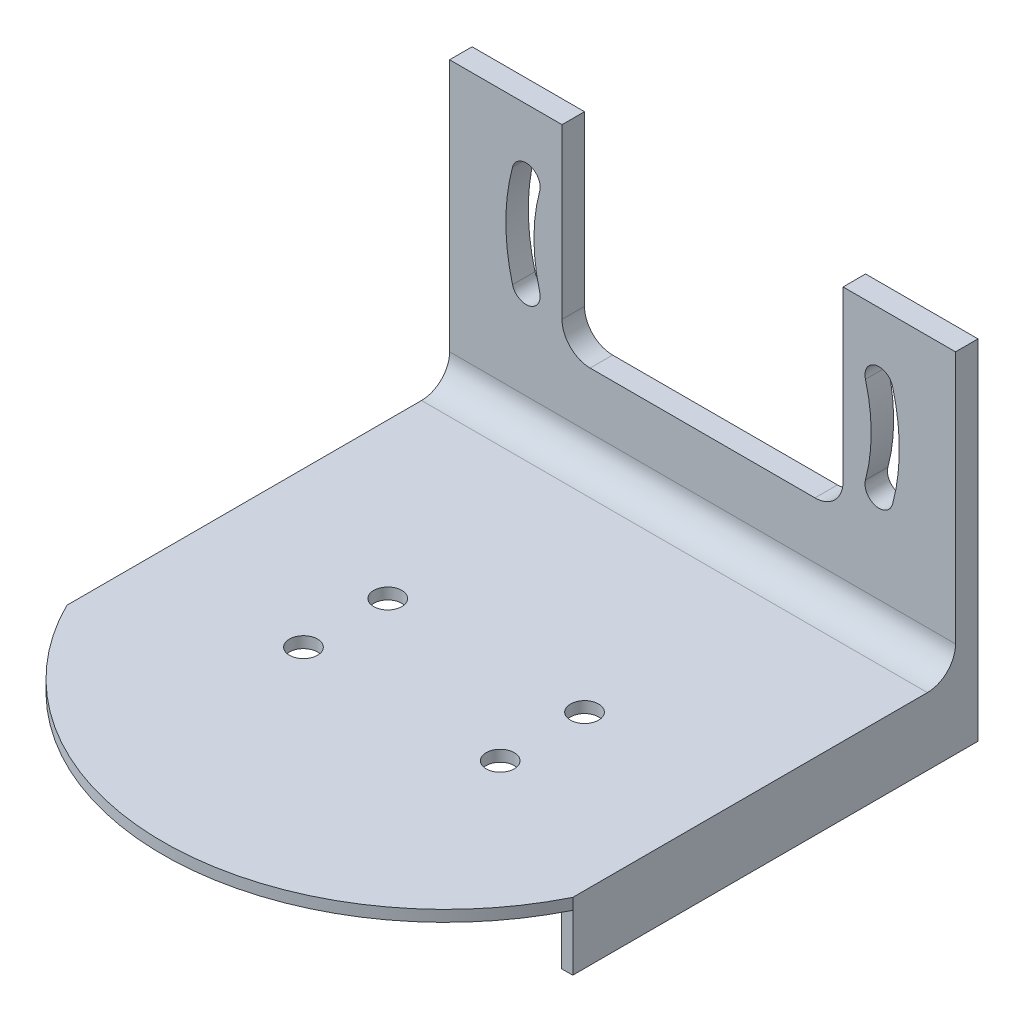
ISO-10303-21;
HEADER;
FILE_DESCRIPTION(('STEP AP214'),'2;1');
FILE_NAME('part.step','',(''),(''),'','','');
FILE_SCHEMA(('AUTOMOTIVE_DESIGN { 1 0 10303 214 1 1 1 1 }'));
ENDSEC;
DATA;
#1=APPLICATION_CONTEXT('core data for automotive mechanical design processes');
#2=APPLICATION_PROTOCOL_DEFINITION('international standard','automotive_design',2000,#1);
#3=PRODUCT_CONTEXT('',#1,'mechanical');
#4=PRODUCT('Part','Part','',(#3));
#5=PRODUCT_RELATED_PRODUCT_CATEGORY('part','',(#4));
#6=PRODUCT_DEFINITION_FORMATION('','',#4);
#7=PRODUCT_DEFINITION_CONTEXT('part definition',#1,'design');
#8=PRODUCT_DEFINITION('design','',#6,#7);
#9=PRODUCT_DEFINITION_SHAPE('','',#8);
#10=(LENGTH_UNIT() NAMED_UNIT(*) SI_UNIT(.MILLI.,.METRE.));
#11=(NAMED_UNIT(*) PLANE_ANGLE_UNIT() SI_UNIT($,.RADIAN.));
#12=(NAMED_UNIT(*) SI_UNIT($,.STERADIAN.) SOLID_ANGLE_UNIT());
#13=UNCERTAINTY_MEASURE_WITH_UNIT(LENGTH_MEASURE(1.E-05),#10,'distance_accuracy_value','');
#14=(GEOMETRIC_REPRESENTATION_CONTEXT(3) GLOBAL_UNCERTAINTY_ASSIGNED_CONTEXT((#13)) GLOBAL_UNIT_ASSIGNED_CONTEXT((#10,
#11,#12)) REPRESENTATION_CONTEXT('',''));
#15=CARTESIAN_POINT('',(0.,0.,0.));
#16=DIRECTION('',(0.,0.,1.));
#17=DIRECTION('',(1.,0.,0.));
#18=AXIS2_PLACEMENT_3D('',#15,#16,#17);
#19=CARTESIAN_POINT('',(0.,0.,0.));
#20=DIRECTION('',(0.,-1.,0.));
#21=DIRECTION('',(0.,0.,-1.));
#22=AXIS2_PLACEMENT_3D('',#19,#20,#21);
#23=PLANE('',#22);
#24=CARTESIAN_POINT('',(-17.5,0.,7.5));
#25=DIRECTION('',(0.,-1.,0.));
#26=DIRECTION('',(0.,0.,-1.));
#27=AXIS2_PLACEMENT_3D('',#24,#25,#26);
#28=CIRCLE('',#27,2.5);
#29=CARTESIAN_POINT('',(-17.5,0.,5.));
#30=VERTEX_POINT('',#29);
#31=EDGE_CURVE('E280',#30,#30,#28,.T.);
#32=ORIENTED_EDGE('',*,*,#31,.F.);
#33=EDGE_LOOP('',(#32));
#34=FACE_BOUND('',#33,.T.);
#35=CARTESIAN_POINT('',(17.5,0.,7.5));
#36=DIRECTION('',(0.,-1.,0.));
#37=DIRECTION('',(0.,0.,-1.));
#38=AXIS2_PLACEMENT_3D('',#35,#36,#37);
#39=CIRCLE('',#38,2.5);
#40=CARTESIAN_POINT('',(17.5,0.,5.));
#41=VERTEX_POINT('',#40);
#42=EDGE_CURVE('E284',#41,#41,#39,.T.);
#43=ORIENTED_EDGE('',*,*,#42,.F.);
#44=EDGE_LOOP('',(#43));
#45=FACE_BOUND('',#44,.T.);
#46=CARTESIAN_POINT('',(17.5,0.,-7.5));
#47=DIRECTION('',(0.,-1.,0.));
#48=DIRECTION('',(0.,0.,-1.));
#49=AXIS2_PLACEMENT_3D('',#46,#47,#48);
#50=CIRCLE('',#49,2.5);
#51=CARTESIAN_POINT('',(17.5,0.,-10.));
#52=VERTEX_POINT('',#51);
#53=EDGE_CURVE('E288',#52,#52,#50,.T.);
#54=ORIENTED_EDGE('',*,*,#53,.F.);
#55=EDGE_LOOP('',(#54));
#56=FACE_BOUND('',#55,.T.);
#57=CARTESIAN_POINT('',(-17.5,0.,-7.5));
#58=DIRECTION('',(0.,-1.,0.));
#59=DIRECTION('',(0.,0.,-1.));
#60=AXIS2_PLACEMENT_3D('',#57,#58,#59);
#61=CIRCLE('',#60,2.5);
#62=CARTESIAN_POINT('',(-17.5,0.,-10.));
#63=VERTEX_POINT('',#62);
#64=EDGE_CURVE('E292',#63,#63,#61,.T.);
#65=ORIENTED_EDGE('',*,*,#64,.F.);
#66=EDGE_LOOP('',(#65));
#67=FACE_BOUND('',#66,.T.);
#68=DIRECTION('',(0.,0.,-1.));
#69=VECTOR('',#68,1.);
#70=CARTESIAN_POINT('',(43.,0.,-50.));
#71=LINE('',#70,#69);
#72=CARTESIAN_POINT('',(43.,0.,22.0935167306728));
#73=VERTEX_POINT('',#72);
#74=CARTESIAN_POINT('',(43.,0.,-50.));
#75=VERTEX_POINT('',#74);
#76=EDGE_CURVE('E51',#73,#75,#71,.T.);
#77=ORIENTED_EDGE('',*,*,#76,.F.);
#78=DIRECTION('',(-1.,0.,0.));
#79=VECTOR('',#78,1.);
#80=CARTESIAN_POINT('',(45.,0.,22.0935167306728));
#81=LINE('',#80,#79);
#82=CARTESIAN_POINT('',(45.,0.,22.0935167306728));
#83=VERTEX_POINT('',#82);
#84=EDGE_CURVE('E555',#83,#73,#81,.T.);
#85=ORIENTED_EDGE('',*,*,#84,.F.);
#86=CARTESIAN_POINT('',(0.,0.,-0.235133201877558));
#87=DIRECTION('',(0.,-1.,0.));
#88=DIRECTION('',(0.,0.,-1.));
#89=AXIS2_PLACEMENT_3D('',#86,#87,#88);
#90=CIRCLE('',#89,50.2351332018776);
#91=CARTESIAN_POINT('',(-45.,0.,22.0935167306728));
#92=VERTEX_POINT('',#91);
#93=EDGE_CURVE('E259',#92,#83,#90,.F.);
#94=ORIENTED_EDGE('',*,*,#93,.F.);
#95=DIRECTION('',(-1.,0.,0.));
#96=VECTOR('',#95,1.);
#97=CARTESIAN_POINT('',(-45.,0.,22.0935167306728));
#98=LINE('',#97,#96);
#99=CARTESIAN_POINT('',(-43.,0.,22.0935167306728));
#100=VERTEX_POINT('',#99);
#101=EDGE_CURVE('E233',#100,#92,#98,.T.);
#102=ORIENTED_EDGE('',*,*,#101,.F.);
#103=DIRECTION('',(0.,0.,1.));
#104=VECTOR('',#103,1.);
#105=CARTESIAN_POINT('',(-43.,0.,-50.));
#106=LINE('',#105,#104);
#107=CARTESIAN_POINT('',(-43.,0.,-50.));
#108=VERTEX_POINT('',#107);
#109=EDGE_CURVE('E230',#108,#100,#106,.T.);
#110=ORIENTED_EDGE('',*,*,#109,.F.);
#111=DIRECTION('',(-1.,0.,0.));
#112=VECTOR('',#111,1.);
#113=CARTESIAN_POINT('',(100.,0.,-50.));
#114=LINE('',#113,#112);
#115=EDGE_CURVE('E37',#75,#108,#114,.T.);
#116=ORIENTED_EDGE('',*,*,#115,.F.);
#117=EDGE_LOOP('',(#77,#85,#94,#102,#110,#116));
#118=FACE_BOUND('',#117,.T.);
#119=ADVANCED_FACE('F33',(#34,#45,#56,#67,#118),#23,.T.);
#120=CARTESIAN_POINT('',(0.,2.,0.));
#121=DIRECTION('',(0.,-1.,0.));
#122=DIRECTION('',(0.,0.,-1.));
#123=AXIS2_PLACEMENT_3D('',#120,#121,#122);
#124=PLANE('',#123);
#125=CARTESIAN_POINT('',(-17.5,2.,7.5));
#126=DIRECTION('',(0.,1.,0.));
#127=DIRECTION('',(0.,0.,-1.));
#128=AXIS2_PLACEMENT_3D('',#125,#126,#127);
#129=CIRCLE('',#128,2.5);
#130=CARTESIAN_POINT('',(-17.5,2.,5.));
#131=VERTEX_POINT('',#130);
#132=EDGE_CURVE('E277',#131,#131,#129,.T.);
#133=ORIENTED_EDGE('',*,*,#132,.F.);
#134=EDGE_LOOP('',(#133));
#135=FACE_BOUND('',#134,.T.);
#136=CARTESIAN_POINT('',(17.5,2.,7.5));
#137=DIRECTION('',(0.,1.,0.));
#138=DIRECTION('',(0.,0.,1.));
#139=AXIS2_PLACEMENT_3D('',#136,#137,#138);
#140=CIRCLE('',#139,2.5);
#141=CARTESIAN_POINT('',(17.5,2.,10.));
#142=VERTEX_POINT('',#141);
#143=EDGE_CURVE('E281',#142,#142,#140,.T.);
#144=ORIENTED_EDGE('',*,*,#143,.F.);
#145=EDGE_LOOP('',(#144));
#146=FACE_BOUND('',#145,.T.);
#147=CARTESIAN_POINT('',(17.5,2.,-7.5));
#148=DIRECTION('',(0.,1.,0.));
#149=DIRECTION('',(0.,0.,-1.));
#150=AXIS2_PLACEMENT_3D('',#147,#148,#149);
#151=CIRCLE('',#150,2.5);
#152=CARTESIAN_POINT('',(17.5,2.,-10.));
#153=VERTEX_POINT('',#152);
#154=EDGE_CURVE('E285',#153,#153,#151,.T.);
#155=ORIENTED_EDGE('',*,*,#154,.F.);
#156=EDGE_LOOP('',(#155));
#157=FACE_BOUND('',#156,.T.);
#158=CARTESIAN_POINT('',(-17.5,2.,-7.5));
#159=DIRECTION('',(0.,1.,0.));
#160=DIRECTION('',(0.,0.,1.));
#161=AXIS2_PLACEMENT_3D('',#158,#159,#160);
#162=CIRCLE('',#161,2.5);
#163=CARTESIAN_POINT('',(-17.5,2.,-5.));
#164=VERTEX_POINT('',#163);
#165=EDGE_CURVE('E289',#164,#164,#162,.T.);
#166=ORIENTED_EDGE('',*,*,#165,.F.);
#167=EDGE_LOOP('',(#166));
#168=FACE_BOUND('',#167,.T.);
#169=DIRECTION('',(0.,0.,-1.));
#170=VECTOR('',#169,1.);
#171=CARTESIAN_POINT('',(-45.,2.,0.));
#172=LINE('',#171,#170);
#173=CARTESIAN_POINT('',(-45.,2.,22.0935167306728));
#174=VERTEX_POINT('',#173);
#175=CARTESIAN_POINT('',(-45.,2.,-41.));
#176=VERTEX_POINT('',#175);
#177=EDGE_CURVE('E275',#174,#176,#172,.T.);
#178=ORIENTED_EDGE('',*,*,#177,.F.);
#179=CARTESIAN_POINT('',(0.,2.,-0.235133201877558));
#180=DIRECTION('',(0.,-1.,0.));
#181=DIRECTION('',(0.,0.,-1.));
#182=AXIS2_PLACEMENT_3D('',#179,#180,#181);
#183=CIRCLE('',#182,50.2351332018776);
#184=CARTESIAN_POINT('',(45.,2.,22.0935167306728));
#185=VERTEX_POINT('',#184);
#186=EDGE_CURVE('E261',#174,#185,#183,.F.);
#187=ORIENTED_EDGE('',*,*,#186,.T.);
#188=DIRECTION('',(0.,0.,-1.));
#189=VECTOR('',#188,1.);
#190=CARTESIAN_POINT('',(45.,2.,0.));
#191=LINE('',#190,#189);
#192=CARTESIAN_POINT('',(45.,2.,-41.));
#193=VERTEX_POINT('',#192);
#194=EDGE_CURVE('E272',#185,#193,#191,.T.);
#195=ORIENTED_EDGE('',*,*,#194,.T.);
#196=DIRECTION('',(-1.,0.,0.));
#197=VECTOR('',#196,1.);
#198=CARTESIAN_POINT('',(45.,2.,-41.));
#199=LINE('',#198,#197);
#200=EDGE_CURVE('E269',#193,#176,#199,.T.);
#201=ORIENTED_EDGE('',*,*,#200,.T.);
#202=EDGE_LOOP('',(#178,#187,#195,#201));
#203=FACE_BOUND('',#202,.T.);
#204=ADVANCED_FACE('F416',(#135,#146,#157,#168,#203),#124,.F.);
#205=CARTESIAN_POINT('',(100.,2.,-50.));
#206=DIRECTION('',(0.,0.,1.));
#207=DIRECTION('',(1.,0.,0.));
#208=AXIS2_PLACEMENT_3D('',#205,#206,#207);
#209=PLANE('',#208);
#210=CARTESIAN_POINT('',(0.,32.,-50.));
#211=DIRECTION('',(0.,0.,-1.));
#212=DIRECTION('',(-1.,0.,0.));
#213=AXIS2_PLACEMENT_3D('',#210,#211,#212);
#214=CIRCLE('',#213,35.);
#215=CARTESIAN_POINT('',(33.8074039201174,41.0586665785883,-50.));
#216=VERTEX_POINT('',#215);
#217=CARTESIAN_POINT('',(33.8074039201174,22.9413334214118,-50.));
#218=VERTEX_POINT('',#217);
#219=EDGE_CURVE('E315',#216,#218,#214,.T.);
#220=ORIENTED_EDGE('',*,*,#219,.F.);
#221=CARTESIAN_POINT('',(31.3925893543947,40.4116189658319,-50.));
#222=DIRECTION('',(0.,0.,-1.));
#223=DIRECTION('',(-1.,0.,0.));
#224=AXIS2_PLACEMENT_3D('',#221,#222,#223);
#225=CIRCLE('',#224,2.5);
#226=CARTESIAN_POINT('',(28.977774788672,39.7645713530756,-50.));
#227=VERTEX_POINT('',#226);
#228=EDGE_CURVE('E307',#227,#216,#225,.T.);
#229=ORIENTED_EDGE('',*,*,#228,.F.);
#230=CARTESIAN_POINT('',(0.,32.,-50.));
#231=DIRECTION('',(0.,0.,1.));
#232=DIRECTION('',(-1.,0.,0.));
#233=AXIS2_PLACEMENT_3D('',#230,#231,#232);
#234=CIRCLE('',#233,30.);
#235=CARTESIAN_POINT('',(28.977774788672,24.2354286469244,-50.));
#236=VERTEX_POINT('',#235);
#237=EDGE_CURVE('E321',#236,#227,#234,.T.);
#238=ORIENTED_EDGE('',*,*,#237,.F.);
#239=CARTESIAN_POINT('',(31.3925893543947,23.5883810341681,-50.));
#240=DIRECTION('',(0.,0.,-1.));
#241=DIRECTION('',(1.,0.,0.));
#242=AXIS2_PLACEMENT_3D('',#239,#240,#241);
#243=CIRCLE('',#242,2.5);
#244=EDGE_CURVE('E318',#218,#236,#243,.T.);
#245=ORIENTED_EDGE('',*,*,#244,.F.);
#246=EDGE_LOOP('',(#220,#229,#238,#245));
#247=FACE_BOUND('',#246,.T.);
#248=CARTESIAN_POINT('',(-31.3925893543947,23.5883810341681,-50.));
#249=DIRECTION('',(0.,0.,-1.));
#250=DIRECTION('',(-1.,0.,0.));
#251=AXIS2_PLACEMENT_3D('',#248,#249,#250);
#252=CIRCLE('',#251,2.50000000000001);
#253=CARTESIAN_POINT('',(-28.9777747886721,24.2354286469244,-50.));
#254=VERTEX_POINT('',#253);
#255=CARTESIAN_POINT('',(-33.8074039201174,22.9413334214118,-50.));
#256=VERTEX_POINT('',#255);
#257=EDGE_CURVE('E295',#254,#256,#252,.T.);
#258=ORIENTED_EDGE('',*,*,#257,.F.);
#259=CARTESIAN_POINT('',(0.,32.,-50.));
#260=DIRECTION('',(0.,0.,1.));
#261=DIRECTION('',(-1.,0.,0.));
#262=AXIS2_PLACEMENT_3D('',#259,#260,#261);
#263=CIRCLE('',#262,30.);
#264=CARTESIAN_POINT('',(-28.977774788672,39.7645713530756,-50.));
#265=VERTEX_POINT('',#264);
#266=EDGE_CURVE('E293',#265,#254,#263,.T.);
#267=ORIENTED_EDGE('',*,*,#266,.F.);
#268=CARTESIAN_POINT('',(-31.3925893543947,40.411618965832,-50.));
#269=DIRECTION('',(0.,0.,-1.));
#270=DIRECTION('',(1.,0.,0.));
#271=AXIS2_PLACEMENT_3D('',#268,#269,#270);
#272=CIRCLE('',#271,2.5);
#273=CARTESIAN_POINT('',(-33.8074039201174,41.0586665785883,-50.));
#274=VERTEX_POINT('',#273);
#275=EDGE_CURVE('E301',#274,#265,#272,.T.);
#276=ORIENTED_EDGE('',*,*,#275,.F.);
#277=CARTESIAN_POINT('',(0.,32.,-50.));
#278=DIRECTION('',(0.,0.,-1.));
#279=DIRECTION('',(-1.,0.,0.));
#280=AXIS2_PLACEMENT_3D('',#277,#278,#279);
#281=CIRCLE('',#280,35.);
#282=EDGE_CURVE('E298',#256,#274,#281,.T.);
#283=ORIENTED_EDGE('',*,*,#282,.F.);
#284=EDGE_LOOP('',(#258,#267,#276,#283));
#285=FACE_BOUND('',#284,.T.);
#286=DIRECTION('',(0.,-1.,0.));
#287=VECTOR('',#286,1.);
#288=CARTESIAN_POINT('',(45.,52.,-50.));
#289=LINE('',#288,#287);
#290=CARTESIAN_POINT('',(45.,52.,-50.));
#291=VERTEX_POINT('',#290);
#292=CARTESIAN_POINT('',(45.,-10.,-50.));
#293=VERTEX_POINT('',#292);
#294=EDGE_CURVE('E561',#291,#293,#289,.T.);
#295=ORIENTED_EDGE('',*,*,#294,.T.);
#296=DIRECTION('',(1.,0.,0.));
#297=VECTOR('',#296,1.);
#298=CARTESIAN_POINT('',(45.,-10.,-50.));
#299=LINE('',#298,#297);
#300=CARTESIAN_POINT('',(43.,-10.,-50.));
#301=VERTEX_POINT('',#300);
#302=EDGE_CURVE('E222',#301,#293,#299,.T.);
#303=ORIENTED_EDGE('',*,*,#302,.F.);
#304=DIRECTION('',(0.,1.,0.));
#305=VECTOR('',#304,1.);
#306=CARTESIAN_POINT('',(43.,-10.,-50.));
#307=LINE('',#306,#305);
#308=EDGE_CURVE('E235',#301,#75,#307,.T.);
#309=ORIENTED_EDGE('',*,*,#308,.T.);
#310=ORIENTED_EDGE('',*,*,#115,.T.);
#311=DIRECTION('',(0.,1.,0.));
#312=VECTOR('',#311,1.);
#313=CARTESIAN_POINT('',(-43.,-10.,-50.));
#314=LINE('',#313,#312);
#315=CARTESIAN_POINT('',(-43.,-10.,-50.));
#316=VERTEX_POINT('',#315);
#317=EDGE_CURVE('E256',#316,#108,#314,.T.);
#318=ORIENTED_EDGE('',*,*,#317,.F.);
#319=DIRECTION('',(1.,0.,0.));
#320=VECTOR('',#319,1.);
#321=CARTESIAN_POINT('',(-45.,-10.,-50.));
#322=LINE('',#321,#320);
#323=CARTESIAN_POINT('',(-45.,-10.,-50.));
#324=VERTEX_POINT('',#323);
#325=EDGE_CURVE('E242',#324,#316,#322,.T.);
#326=ORIENTED_EDGE('',*,*,#325,.F.);
#327=DIRECTION('',(0.,-1.,0.));
#328=VECTOR('',#327,1.);
#329=CARTESIAN_POINT('',(-45.,52.,-50.));
#330=LINE('',#329,#328);
#331=CARTESIAN_POINT('',(-45.,52.,-50.));
#332=VERTEX_POINT('',#331);
#333=EDGE_CURVE('E392',#332,#324,#330,.T.);
#334=ORIENTED_EDGE('',*,*,#333,.F.);
#335=DIRECTION('',(-1.,0.,0.));
#336=VECTOR('',#335,1.);
#337=CARTESIAN_POINT('',(0.,52.,-50.));
#338=LINE('',#337,#336);
#339=CARTESIAN_POINT('',(-25.,52.,-50.));
#340=VERTEX_POINT('',#339);
#341=EDGE_CURVE('E360',#340,#332,#338,.T.);
#342=ORIENTED_EDGE('',*,*,#341,.F.);
#343=DIRECTION('',(0.,-1.,0.));
#344=VECTOR('',#343,1.);
#345=CARTESIAN_POINT('',(-25.,0.,-50.));
#346=LINE('',#345,#344);
#347=CARTESIAN_POINT('',(-25.,22.,-50.));
#348=VERTEX_POINT('',#347);
#349=EDGE_CURVE('E339',#340,#348,#346,.T.);
#350=ORIENTED_EDGE('',*,*,#349,.T.);
#351=CARTESIAN_POINT('',(-20.,22.,-50.));
#352=DIRECTION('',(0.,0.,-1.));
#353=DIRECTION('',(-1.,0.,0.));
#354=AXIS2_PLACEMENT_3D('',#351,#352,#353);
#355=CIRCLE('',#354,5.);
#356=CARTESIAN_POINT('',(-20.,17.,-50.));
#357=VERTEX_POINT('',#356);
#358=EDGE_CURVE('E336',#357,#348,#355,.T.);
#359=ORIENTED_EDGE('',*,*,#358,.F.);
#360=DIRECTION('',(1.,0.,0.));
#361=VECTOR('',#360,1.);
#362=CARTESIAN_POINT('',(0.,17.,-50.));
#363=LINE('',#362,#361);
#364=CARTESIAN_POINT('',(20.,17.,-50.));
#365=VERTEX_POINT('',#364);
#366=EDGE_CURVE('E327',#357,#365,#363,.T.);
#367=ORIENTED_EDGE('',*,*,#366,.T.);
#368=CARTESIAN_POINT('',(20.,22.,-50.));
#369=DIRECTION('',(0.,0.,-1.));
#370=DIRECTION('',(-1.,0.,0.));
#371=AXIS2_PLACEMENT_3D('',#368,#369,#370);
#372=CIRCLE('',#371,5.);
#373=CARTESIAN_POINT('',(25.,22.,-50.));
#374=VERTEX_POINT('',#373);
#375=EDGE_CURVE('E345',#365,#374,#372,.F.);
#376=ORIENTED_EDGE('',*,*,#375,.T.);
#377=DIRECTION('',(0.,1.,0.));
#378=VECTOR('',#377,1.);
#379=CARTESIAN_POINT('',(25.,0.,-50.));
#380=LINE('',#379,#378);
#381=CARTESIAN_POINT('',(25.,52.,-50.));
#382=VERTEX_POINT('',#381);
#383=EDGE_CURVE('E342',#374,#382,#380,.T.);
#384=ORIENTED_EDGE('',*,*,#383,.T.);
#385=EDGE_CURVE('E370',#291,#382,#338,.T.);
#386=ORIENTED_EDGE('',*,*,#385,.F.);
#387=EDGE_LOOP('',(#295,#303,#309,#310,#318,#326,#334,#342,#350,#359,#367,#376,#384,#386));
#388=FACE_BOUND('',#387,.T.);
#389=ADVANCED_FACE('F35',(#247,#285,#388),#209,.F.);
#390=CARTESIAN_POINT('',(-45.,52.,-46.));
#391=DIRECTION('',(0.,0.,-1.));
#392=DIRECTION('',(-1.,0.,0.));
#393=AXIS2_PLACEMENT_3D('',#390,#391,#392);
#394=PLANE('',#393);
#395=CARTESIAN_POINT('',(-31.3925893543947,40.411618965832,-46.));
#396=DIRECTION('',(0.,0.,-1.));
#397=DIRECTION('',(-1.,0.,0.));
#398=AXIS2_PLACEMENT_3D('',#395,#396,#397);
#399=CIRCLE('',#398,2.5);
#400=CARTESIAN_POINT('',(-33.8074039201174,41.0586665785883,-46.));
#401=VERTEX_POINT('',#400);
#402=CARTESIAN_POINT('',(-28.977774788672,39.7645713530756,-46.));
#403=VERTEX_POINT('',#402);
#404=EDGE_CURVE('E602',#401,#403,#399,.T.);
#405=ORIENTED_EDGE('',*,*,#404,.T.);
#406=CARTESIAN_POINT('',(0.,32.,-46.));
#407=DIRECTION('',(0.,0.,-1.));
#408=DIRECTION('',(-1.,0.,0.));
#409=AXIS2_PLACEMENT_3D('',#406,#407,#408);
#410=CIRCLE('',#409,30.);
#411=CARTESIAN_POINT('',(-28.9777747886721,24.2354286469244,-46.));
#412=VERTEX_POINT('',#411);
#413=EDGE_CURVE('E43',#403,#412,#410,.F.);
#414=ORIENTED_EDGE('',*,*,#413,.T.);
#415=CARTESIAN_POINT('',(-31.3925893543947,23.5883810341681,-46.));
#416=DIRECTION('',(0.,0.,-1.));
#417=DIRECTION('',(-1.,0.,0.));
#418=AXIS2_PLACEMENT_3D('',#415,#416,#417);
#419=CIRCLE('',#418,2.50000000000001);
#420=CARTESIAN_POINT('',(-33.8074039201174,22.9413334214118,-46.));
#421=VERTEX_POINT('',#420);
#422=EDGE_CURVE('E596',#412,#421,#419,.T.);
#423=ORIENTED_EDGE('',*,*,#422,.T.);
#424=CARTESIAN_POINT('',(0.,32.,-46.));
#425=DIRECTION('',(0.,0.,-1.));
#426=DIRECTION('',(-1.,0.,0.));
#427=AXIS2_PLACEMENT_3D('',#424,#425,#426);
#428=CIRCLE('',#427,35.);
#429=EDGE_CURVE('E599',#421,#401,#428,.T.);
#430=ORIENTED_EDGE('',*,*,#429,.T.);
#431=EDGE_LOOP('',(#405,#414,#423,#430));
#432=FACE_BOUND('',#431,.T.);
#433=CARTESIAN_POINT('',(0.,32.,-46.));
#434=DIRECTION('',(0.,0.,-1.));
#435=DIRECTION('',(-1.,0.,0.));
#436=AXIS2_PLACEMENT_3D('',#433,#434,#435);
#437=CIRCLE('',#436,30.);
#438=CARTESIAN_POINT('',(28.977774788672,24.2354286469244,-46.));
#439=VERTEX_POINT('',#438);
#440=CARTESIAN_POINT('',(28.977774788672,39.7645713530756,-46.));
#441=VERTEX_POINT('',#440);
#442=EDGE_CURVE('E590',#439,#441,#437,.F.);
#443=ORIENTED_EDGE('',*,*,#442,.T.);
#444=CARTESIAN_POINT('',(31.3925893543947,40.4116189658319,-46.));
#445=DIRECTION('',(0.,0.,-1.));
#446=DIRECTION('',(-1.,0.,0.));
#447=AXIS2_PLACEMENT_3D('',#444,#445,#446);
#448=CIRCLE('',#447,2.5);
#449=CARTESIAN_POINT('',(33.8074039201174,41.0586665785883,-46.));
#450=VERTEX_POINT('',#449);
#451=EDGE_CURVE('E593',#441,#450,#448,.T.);
#452=ORIENTED_EDGE('',*,*,#451,.T.);
#453=CARTESIAN_POINT('',(0.,32.,-46.));
#454=DIRECTION('',(0.,0.,-1.));
#455=DIRECTION('',(-1.,0.,0.));
#456=AXIS2_PLACEMENT_3D('',#453,#454,#455);
#457=CIRCLE('',#456,35.);
#458=CARTESIAN_POINT('',(33.8074039201174,22.9413334214118,-46.));
#459=VERTEX_POINT('',#458);
#460=EDGE_CURVE('E584',#450,#459,#457,.T.);
#461=ORIENTED_EDGE('',*,*,#460,.T.);
#462=CARTESIAN_POINT('',(31.3925893543947,23.5883810341681,-46.));
#463=DIRECTION('',(0.,0.,-1.));
#464=DIRECTION('',(-1.,0.,0.));
#465=AXIS2_PLACEMENT_3D('',#462,#463,#464);
#466=CIRCLE('',#465,2.5);
#467=EDGE_CURVE('E587',#459,#439,#466,.T.);
#468=ORIENTED_EDGE('',*,*,#467,.T.);
#469=EDGE_LOOP('',(#443,#452,#461,#468));
#470=FACE_BOUND('',#469,.T.);
#471=DIRECTION('',(0.,-1.,0.));
#472=VECTOR('',#471,1.);
#473=CARTESIAN_POINT('',(-45.,52.,-46.));
#474=LINE('',#473,#472);
#475=CARTESIAN_POINT('',(-45.,52.,-46.));
#476=VERTEX_POINT('',#475);
#477=CARTESIAN_POINT('',(-45.,7.00000000000004,-46.));
#478=VERTEX_POINT('',#477);
#479=EDGE_CURVE('E567',#476,#478,#474,.T.);
#480=ORIENTED_EDGE('',*,*,#479,.T.);
#481=DIRECTION('',(-1.,0.,0.));
#482=VECTOR('',#481,1.);
#483=CARTESIAN_POINT('',(45.,7.00000000000004,-46.));
#484=LINE('',#483,#482);
#485=CARTESIAN_POINT('',(45.,7.00000000000004,-46.));
#486=VERTEX_POINT('',#485);
#487=EDGE_CURVE('E266',#486,#478,#484,.T.);
#488=ORIENTED_EDGE('',*,*,#487,.F.);
#489=DIRECTION('',(0.,-1.,0.));
#490=VECTOR('',#489,1.);
#491=CARTESIAN_POINT('',(45.,52.,-46.));
#492=LINE('',#491,#490);
#493=CARTESIAN_POINT('',(45.,52.,-46.));
#494=VERTEX_POINT('',#493);
#495=EDGE_CURVE('E563',#494,#486,#492,.T.);
#496=ORIENTED_EDGE('',*,*,#495,.F.);
#497=DIRECTION('',(1.,0.,0.));
#498=VECTOR('',#497,1.);
#499=CARTESIAN_POINT('',(-45.,52.,-46.));
#500=LINE('',#499,#498);
#501=CARTESIAN_POINT('',(25.,52.,-46.));
#502=VERTEX_POINT('',#501);
#503=EDGE_CURVE('E633',#502,#494,#500,.T.);
#504=ORIENTED_EDGE('',*,*,#503,.F.);
#505=DIRECTION('',(0.,1.,0.));
#506=VECTOR('',#505,1.);
#507=CARTESIAN_POINT('',(25.,52.,-46.));
#508=LINE('',#507,#506);
#509=CARTESIAN_POINT('',(25.,22.,-46.));
#510=VERTEX_POINT('',#509);
#511=EDGE_CURVE('E358',#510,#502,#508,.T.);
#512=ORIENTED_EDGE('',*,*,#511,.F.);
#513=CARTESIAN_POINT('',(20.,22.,-46.));
#514=DIRECTION('',(0.,0.,-1.));
#515=DIRECTION('',(-1.,0.,0.));
#516=AXIS2_PLACEMENT_3D('',#513,#514,#515);
#517=CIRCLE('',#516,5.);
#518=CARTESIAN_POINT('',(20.,17.,-46.));
#519=VERTEX_POINT('',#518);
#520=EDGE_CURVE('E582',#519,#510,#517,.F.);
#521=ORIENTED_EDGE('',*,*,#520,.F.);
#522=DIRECTION('',(1.,0.,0.));
#523=VECTOR('',#522,1.);
#524=CARTESIAN_POINT('',(-45.,17.,-46.));
#525=LINE('',#524,#523);
#526=CARTESIAN_POINT('',(-20.,17.,-46.));
#527=VERTEX_POINT('',#526);
#528=EDGE_CURVE('E580',#527,#519,#525,.T.);
#529=ORIENTED_EDGE('',*,*,#528,.F.);
#530=CARTESIAN_POINT('',(-20.,22.,-46.));
#531=DIRECTION('',(0.,0.,-1.));
#532=DIRECTION('',(-1.,0.,0.));
#533=AXIS2_PLACEMENT_3D('',#530,#531,#532);
#534=CIRCLE('',#533,5.);
#535=CARTESIAN_POINT('',(-25.,22.,-46.));
#536=VERTEX_POINT('',#535);
#537=EDGE_CURVE('E577',#527,#536,#534,.T.);
#538=ORIENTED_EDGE('',*,*,#537,.T.);
#539=DIRECTION('',(0.,-1.,0.));
#540=VECTOR('',#539,1.);
#541=CARTESIAN_POINT('',(-25.,52.,-46.));
#542=LINE('',#541,#540);
#543=CARTESIAN_POINT('',(-25.,52.,-46.));
#544=VERTEX_POINT('',#543);
#545=EDGE_CURVE('E351',#544,#536,#542,.T.);
#546=ORIENTED_EDGE('',*,*,#545,.F.);
#547=EDGE_CURVE('E363',#476,#544,#500,.T.);
#548=ORIENTED_EDGE('',*,*,#547,.F.);
#549=EDGE_LOOP('',(#480,#488,#496,#504,#512,#521,#529,#538,#546,#548));
#550=FACE_BOUND('',#549,.T.);
#551=ADVANCED_FACE('F429',(#432,#470,#550),#394,.F.);
#552=CARTESIAN_POINT('',(0.,52.,0.));
#553=DIRECTION('',(0.,-1.,0.));
#554=DIRECTION('',(0.,0.,-1.));
#555=AXIS2_PLACEMENT_3D('',#552,#553,#554);
#556=PLANE('',#555);
#557=DIRECTION('',(0.,0.,-1.));
#558=VECTOR('',#557,1.);
#559=CARTESIAN_POINT('',(25.,52.,0.));
#560=LINE('',#559,#558);
#561=EDGE_CURVE('E575',#502,#382,#560,.T.);
#562=ORIENTED_EDGE('',*,*,#561,.F.);
#563=ORIENTED_EDGE('',*,*,#503,.T.);
#564=DIRECTION('',(0.,0.,-1.));
#565=VECTOR('',#564,1.);
#566=CARTESIAN_POINT('',(45.,52.,-50.));
#567=LINE('',#566,#565);
#568=EDGE_CURVE('E564',#494,#291,#567,.T.);
#569=ORIENTED_EDGE('',*,*,#568,.T.);
#570=ORIENTED_EDGE('',*,*,#385,.T.);
#571=EDGE_LOOP('',(#562,#563,#569,#570));
#572=FACE_BOUND('',#571,.T.);
#573=ADVANCED_FACE('F432',(#572),#556,.F.);
#574=DIRECTION('',(0.,0.,1.));
#575=VECTOR('',#574,1.);
#576=CARTESIAN_POINT('',(-25.,52.,0.));
#577=LINE('',#576,#575);
#578=EDGE_CURVE('E391',#340,#544,#577,.T.);
#579=ORIENTED_EDGE('',*,*,#578,.F.);
#580=ORIENTED_EDGE('',*,*,#341,.T.);
#581=DIRECTION('',(0.,0.,1.));
#582=VECTOR('',#581,1.);
#583=CARTESIAN_POINT('',(-45.,52.,-50.));
#584=LINE('',#583,#582);
#585=EDGE_CURVE('E373',#332,#476,#584,.T.);
#586=ORIENTED_EDGE('',*,*,#585,.T.);
#587=ORIENTED_EDGE('',*,*,#547,.T.);
#588=EDGE_LOOP('',(#579,#580,#586,#587));
#589=FACE_BOUND('',#588,.T.);
#590=ADVANCED_FACE('F428',(#589),#556,.F.);
#591=CARTESIAN_POINT('',(-45.,52.,-50.));
#592=DIRECTION('',(1.,0.,0.));
#593=DIRECTION('',(0.,0.,-1.));
#594=AXIS2_PLACEMENT_3D('',#591,#592,#593);
#595=PLANE('',#594);
#596=ORIENTED_EDGE('',*,*,#333,.T.);
#597=DIRECTION('',(0.,0.,-1.));
#598=VECTOR('',#597,1.);
#599=CARTESIAN_POINT('',(-45.,-10.,-50.));
#600=LINE('',#599,#598);
#601=CARTESIAN_POINT('',(-45.,-10.,22.0935167306728));
#602=VERTEX_POINT('',#601);
#603=EDGE_CURVE('E239',#602,#324,#600,.T.);
#604=ORIENTED_EDGE('',*,*,#603,.F.);
#605=DIRECTION('',(0.,1.,0.));
#606=VECTOR('',#605,1.);
#607=CARTESIAN_POINT('',(-45.,-10.,22.0935167306728));
#608=LINE('',#607,#606);
#609=EDGE_CURVE('E248',#602,#92,#608,.T.);
#610=ORIENTED_EDGE('',*,*,#609,.T.);
#611=DIRECTION('',(0.,-1.,0.));
#612=VECTOR('',#611,1.);
#613=CARTESIAN_POINT('',(-45.,182.295268241175,22.0935167306728));
#614=LINE('',#613,#612);
#615=EDGE_CURVE('E257',#174,#92,#614,.T.);
#616=ORIENTED_EDGE('',*,*,#615,.F.);
#617=ORIENTED_EDGE('',*,*,#177,.T.);
#618=CARTESIAN_POINT('',(-45.,7.,-41.));
#619=DIRECTION('',(1.,0.,0.));
#620=DIRECTION('',(0.,0.,1.));
#621=AXIS2_PLACEMENT_3D('',#618,#619,#620);
#622=CIRCLE('',#621,5.);
#623=EDGE_CURVE('E263',#176,#478,#622,.T.);
#624=ORIENTED_EDGE('',*,*,#623,.T.);
#625=ORIENTED_EDGE('',*,*,#479,.F.);
#626=ORIENTED_EDGE('',*,*,#585,.F.);
#627=EDGE_LOOP('',(#596,#604,#610,#616,#617,#624,#625,#626));
#628=FACE_BOUND('',#627,.T.);
#629=ADVANCED_FACE('F401',(#628),#595,.F.);
#630=CARTESIAN_POINT('',(45.,52.,-50.));
#631=DIRECTION('',(-1.,0.,0.));
#632=DIRECTION('',(0.,0.,1.));
#633=AXIS2_PLACEMENT_3D('',#630,#631,#632);
#634=PLANE('',#633);
#635=ORIENTED_EDGE('',*,*,#194,.F.);
#636=DIRECTION('',(0.,-1.,0.));
#637=VECTOR('',#636,1.);
#638=CARTESIAN_POINT('',(45.,182.295268241175,22.0935167306729));
#639=LINE('',#638,#637);
#640=EDGE_CURVE('E11',#185,#83,#639,.T.);
#641=ORIENTED_EDGE('',*,*,#640,.T.);
#642=DIRECTION('',(0.,1.,0.));
#643=VECTOR('',#642,1.);
#644=CARTESIAN_POINT('',(45.,-10.,22.0935167306728));
#645=LINE('',#644,#643);
#646=CARTESIAN_POINT('',(45.,-10.,22.0935167306728));
#647=VERTEX_POINT('',#646);
#648=EDGE_CURVE('E210',#647,#83,#645,.T.);
#649=ORIENTED_EDGE('',*,*,#648,.F.);
#650=DIRECTION('',(0.,0.,1.));
#651=VECTOR('',#650,1.);
#652=CARTESIAN_POINT('',(45.,-10.,-50.));
#653=LINE('',#652,#651);
#654=EDGE_CURVE('E216',#293,#647,#653,.T.);
#655=ORIENTED_EDGE('',*,*,#654,.F.);
#656=ORIENTED_EDGE('',*,*,#294,.F.);
#657=ORIENTED_EDGE('',*,*,#568,.F.);
#658=ORIENTED_EDGE('',*,*,#495,.T.);
#659=CARTESIAN_POINT('',(45.,7.,-41.));
#660=DIRECTION('',(1.,0.,0.));
#661=DIRECTION('',(0.,0.,1.));
#662=AXIS2_PLACEMENT_3D('',#659,#660,#661);
#663=CIRCLE('',#662,5.);
#664=EDGE_CURVE('E264',#193,#486,#663,.T.);
#665=ORIENTED_EDGE('',*,*,#664,.F.);
#666=EDGE_LOOP('',(#635,#641,#649,#655,#656,#657,#658,#665));
#667=FACE_BOUND('',#666,.T.);
#668=ADVANCED_FACE('F227',(#667),#634,.F.);
#669=CARTESIAN_POINT('',(0.,17.,0.));
#670=DIRECTION('',(0.,1.,0.));
#671=DIRECTION('',(0.,0.,1.));
#672=AXIS2_PLACEMENT_3D('',#669,#670,#671);
#673=PLANE('',#672);
#674=ORIENTED_EDGE('',*,*,#528,.T.);
#675=DIRECTION('',(0.,0.,-1.));
#676=VECTOR('',#675,1.);
#677=CARTESIAN_POINT('',(20.,17.,0.));
#678=LINE('',#677,#676);
#679=EDGE_CURVE('E349',#519,#365,#678,.T.);
#680=ORIENTED_EDGE('',*,*,#679,.T.);
#681=ORIENTED_EDGE('',*,*,#366,.F.);
#682=DIRECTION('',(0.,0.,-1.));
#683=VECTOR('',#682,1.);
#684=CARTESIAN_POINT('',(-20.,17.,0.));
#685=LINE('',#684,#683);
#686=EDGE_CURVE('E348',#527,#357,#685,.T.);
#687=ORIENTED_EDGE('',*,*,#686,.F.);
#688=EDGE_LOOP('',(#674,#680,#681,#687));
#689=FACE_BOUND('',#688,.T.);
#690=ADVANCED_FACE('F436',(#689),#673,.T.);
#691=CARTESIAN_POINT('',(20.,22.,0.));
#692=DIRECTION('',(0.,0.,-1.));
#693=DIRECTION('',(-1.,0.,0.));
#694=AXIS2_PLACEMENT_3D('',#691,#692,#693);
#695=CYLINDRICAL_SURFACE('',#694,5.);
#696=ORIENTED_EDGE('',*,*,#520,.T.);
#697=DIRECTION('',(0.,0.,-1.));
#698=VECTOR('',#697,1.);
#699=CARTESIAN_POINT('',(25.,22.,0.));
#700=LINE('',#699,#698);
#701=EDGE_CURVE('E352',#510,#374,#700,.T.);
#702=ORIENTED_EDGE('',*,*,#701,.T.);
#703=ORIENTED_EDGE('',*,*,#375,.F.);
#704=ORIENTED_EDGE('',*,*,#679,.F.);
#705=EDGE_LOOP('',(#696,#702,#703,#704));
#706=FACE_BOUND('',#705,.T.);
#707=ADVANCED_FACE('F442',(#706),#695,.F.);
#708=CARTESIAN_POINT('',(-20.,22.,0.));
#709=DIRECTION('',(0.,0.,-1.));
#710=DIRECTION('',(-1.,0.,0.));
#711=AXIS2_PLACEMENT_3D('',#708,#709,#710);
#712=CYLINDRICAL_SURFACE('',#711,5.);
#713=ORIENTED_EDGE('',*,*,#686,.T.);
#714=ORIENTED_EDGE('',*,*,#358,.T.);
#715=DIRECTION('',(0.,0.,-1.));
#716=VECTOR('',#715,1.);
#717=CARTESIAN_POINT('',(-25.,22.,0.));
#718=LINE('',#717,#716);
#719=EDGE_CURVE('E354',#536,#348,#718,.T.);
#720=ORIENTED_EDGE('',*,*,#719,.F.);
#721=ORIENTED_EDGE('',*,*,#537,.F.);
#722=EDGE_LOOP('',(#713,#714,#720,#721));
#723=FACE_BOUND('',#722,.T.);
#724=ADVANCED_FACE('F444',(#723),#712,.F.);
#725=CARTESIAN_POINT('',(25.,0.,0.));
#726=DIRECTION('',(-1.,0.,0.));
#727=DIRECTION('',(0.,0.,1.));
#728=AXIS2_PLACEMENT_3D('',#725,#726,#727);
#729=PLANE('',#728);
#730=ORIENTED_EDGE('',*,*,#511,.T.);
#731=ORIENTED_EDGE('',*,*,#561,.T.);
#732=ORIENTED_EDGE('',*,*,#383,.F.);
#733=ORIENTED_EDGE('',*,*,#701,.F.);
#734=EDGE_LOOP('',(#730,#731,#732,#733));
#735=FACE_BOUND('',#734,.T.);
#736=ADVANCED_FACE('F447',(#735),#729,.T.);
#737=CARTESIAN_POINT('',(-25.,0.,0.));
#738=DIRECTION('',(1.,0.,0.));
#739=DIRECTION('',(0.,0.,-1.));
#740=AXIS2_PLACEMENT_3D('',#737,#738,#739);
#741=PLANE('',#740);
#742=ORIENTED_EDGE('',*,*,#545,.T.);
#743=ORIENTED_EDGE('',*,*,#719,.T.);
#744=ORIENTED_EDGE('',*,*,#349,.F.);
#745=ORIENTED_EDGE('',*,*,#578,.T.);
#746=EDGE_LOOP('',(#742,#743,#744,#745));
#747=FACE_BOUND('',#746,.T.);
#748=ADVANCED_FACE('F449',(#747),#741,.T.);
#749=CARTESIAN_POINT('',(31.3925893543947,40.4116189658319,0.));
#750=DIRECTION('',(0.,0.,-1.));
#751=DIRECTION('',(-1.,0.,0.));
#752=AXIS2_PLACEMENT_3D('',#749,#750,#751);
#753=CYLINDRICAL_SURFACE('',#752,2.5);
#754=DIRECTION('',(0.,0.,-1.));
#755=VECTOR('',#754,1.);
#756=CARTESIAN_POINT('',(28.977774788672,39.7645713530756,0.));
#757=LINE('',#756,#755);
#758=EDGE_CURVE('E325',#441,#227,#757,.T.);
#759=ORIENTED_EDGE('',*,*,#758,.T.);
#760=ORIENTED_EDGE('',*,*,#228,.T.);
#761=DIRECTION('',(0.,0.,-1.));
#762=VECTOR('',#761,1.);
#763=CARTESIAN_POINT('',(33.8074039201174,41.0586665785883,0.));
#764=LINE('',#763,#762);
#765=EDGE_CURVE('E324',#450,#216,#764,.T.);
#766=ORIENTED_EDGE('',*,*,#765,.F.);
#767=ORIENTED_EDGE('',*,*,#451,.F.);
#768=EDGE_LOOP('',(#759,#760,#766,#767));
#769=FACE_BOUND('',#768,.T.);
#770=ADVANCED_FACE('F452',(#769),#753,.F.);
#771=CARTESIAN_POINT('',(0.,32.,0.));
#772=DIRECTION('',(0.,0.,-1.));
#773=DIRECTION('',(-1.,0.,0.));
#774=AXIS2_PLACEMENT_3D('',#771,#772,#773);
#775=CYLINDRICAL_SURFACE('',#774,30.);
#776=DIRECTION('',(0.,0.,-1.));
#777=VECTOR('',#776,1.);
#778=CARTESIAN_POINT('',(28.977774788672,24.2354286469244,0.));
#779=LINE('',#778,#777);
#780=EDGE_CURVE('E328',#439,#236,#779,.T.);
#781=ORIENTED_EDGE('',*,*,#780,.T.);
#782=ORIENTED_EDGE('',*,*,#237,.T.);
#783=ORIENTED_EDGE('',*,*,#758,.F.);
#784=ORIENTED_EDGE('',*,*,#442,.F.);
#785=EDGE_LOOP('',(#781,#782,#783,#784));
#786=FACE_BOUND('',#785,.T.);
#787=ADVANCED_FACE('F462',(#786),#775,.T.);
#788=CARTESIAN_POINT('',(31.3925893543947,23.5883810341681,0.));
#789=DIRECTION('',(0.,0.,-1.));
#790=DIRECTION('',(-1.,0.,0.));
#791=AXIS2_PLACEMENT_3D('',#788,#789,#790);
#792=CYLINDRICAL_SURFACE('',#791,2.5);
#793=DIRECTION('',(0.,0.,-1.));
#794=VECTOR('',#793,1.);
#795=CARTESIAN_POINT('',(33.8074039201174,22.9413334214118,0.));
#796=LINE('',#795,#794);
#797=EDGE_CURVE('E330',#459,#218,#796,.T.);
#798=ORIENTED_EDGE('',*,*,#797,.T.);
#799=ORIENTED_EDGE('',*,*,#244,.T.);
#800=ORIENTED_EDGE('',*,*,#780,.F.);
#801=ORIENTED_EDGE('',*,*,#467,.F.);
#802=EDGE_LOOP('',(#798,#799,#800,#801));
#803=FACE_BOUND('',#802,.T.);
#804=ADVANCED_FACE('F468',(#803),#792,.F.);
#805=CARTESIAN_POINT('',(0.,32.,0.));
#806=DIRECTION('',(0.,0.,-1.));
#807=DIRECTION('',(-1.,0.,0.));
#808=AXIS2_PLACEMENT_3D('',#805,#806,#807);
#809=CYLINDRICAL_SURFACE('',#808,35.);
#810=ORIENTED_EDGE('',*,*,#765,.T.);
#811=ORIENTED_EDGE('',*,*,#219,.T.);
#812=ORIENTED_EDGE('',*,*,#797,.F.);
#813=ORIENTED_EDGE('',*,*,#460,.F.);
#814=EDGE_LOOP('',(#810,#811,#812,#813));
#815=FACE_BOUND('',#814,.T.);
#816=ADVANCED_FACE('F464',(#815),#809,.F.);
#817=CARTESIAN_POINT('',(0.,32.,0.));
#818=DIRECTION('',(0.,0.,-1.));
#819=DIRECTION('',(-1.,0.,0.));
#820=AXIS2_PLACEMENT_3D('',#817,#818,#819);
#821=CYLINDRICAL_SURFACE('',#820,30.);
#822=DIRECTION('',(0.,0.,-1.));
#823=VECTOR('',#822,1.);
#824=CARTESIAN_POINT('',(-28.977774788672,39.7645713530756,0.));
#825=LINE('',#824,#823);
#826=EDGE_CURVE('E305',#403,#265,#825,.T.);
#827=ORIENTED_EDGE('',*,*,#826,.T.);
#828=ORIENTED_EDGE('',*,*,#266,.T.);
#829=DIRECTION('',(0.,0.,-1.));
#830=VECTOR('',#829,1.);
#831=CARTESIAN_POINT('',(-28.9777747886721,24.2354286469244,0.));
#832=LINE('',#831,#830);
#833=EDGE_CURVE('E304',#412,#254,#832,.T.);
#834=ORIENTED_EDGE('',*,*,#833,.F.);
#835=ORIENTED_EDGE('',*,*,#413,.F.);
#836=EDGE_LOOP('',(#827,#828,#834,#835));
#837=FACE_BOUND('',#836,.T.);
#838=ADVANCED_FACE('F467',(#837),#821,.T.);
#839=CARTESIAN_POINT('',(-31.3925893543947,40.411618965832,0.));
#840=DIRECTION('',(0.,0.,-1.));
#841=DIRECTION('',(-1.,0.,0.));
#842=AXIS2_PLACEMENT_3D('',#839,#840,#841);
#843=CYLINDRICAL_SURFACE('',#842,2.5);
#844=DIRECTION('',(0.,0.,-1.));
#845=VECTOR('',#844,1.);
#846=CARTESIAN_POINT('',(-33.8074039201174,41.0586665785883,0.));
#847=LINE('',#846,#845);
#848=EDGE_CURVE('E308',#401,#274,#847,.T.);
#849=ORIENTED_EDGE('',*,*,#848,.T.);
#850=ORIENTED_EDGE('',*,*,#275,.T.);
#851=ORIENTED_EDGE('',*,*,#826,.F.);
#852=ORIENTED_EDGE('',*,*,#404,.F.);
#853=EDGE_LOOP('',(#849,#850,#851,#852));
#854=FACE_BOUND('',#853,.T.);
#855=ADVANCED_FACE('F478',(#854),#843,.F.);
#856=CARTESIAN_POINT('',(0.,32.,0.));
#857=DIRECTION('',(0.,0.,-1.));
#858=DIRECTION('',(-1.,0.,0.));
#859=AXIS2_PLACEMENT_3D('',#856,#857,#858);
#860=CYLINDRICAL_SURFACE('',#859,35.);
#861=DIRECTION('',(0.,0.,-1.));
#862=VECTOR('',#861,1.);
#863=CARTESIAN_POINT('',(-33.8074039201174,22.9413334214118,0.));
#864=LINE('',#863,#862);
#865=EDGE_CURVE('E310',#421,#256,#864,.T.);
#866=ORIENTED_EDGE('',*,*,#865,.T.);
#867=ORIENTED_EDGE('',*,*,#282,.T.);
#868=ORIENTED_EDGE('',*,*,#848,.F.);
#869=ORIENTED_EDGE('',*,*,#429,.F.);
#870=EDGE_LOOP('',(#866,#867,#868,#869));
#871=FACE_BOUND('',#870,.T.);
#872=ADVANCED_FACE('F484',(#871),#860,.F.);
#873=CARTESIAN_POINT('',(-31.3925893543947,23.5883810341681,0.));
#874=DIRECTION('',(0.,0.,-1.));
#875=DIRECTION('',(-1.,0.,0.));
#876=AXIS2_PLACEMENT_3D('',#873,#874,#875);
#877=CYLINDRICAL_SURFACE('',#876,2.50000000000001);
#878=ORIENTED_EDGE('',*,*,#833,.T.);
#879=ORIENTED_EDGE('',*,*,#257,.T.);
#880=ORIENTED_EDGE('',*,*,#865,.F.);
#881=ORIENTED_EDGE('',*,*,#422,.F.);
#882=EDGE_LOOP('',(#878,#879,#880,#881));
#883=FACE_BOUND('',#882,.T.);
#884=ADVANCED_FACE('F480',(#883),#877,.F.);
#885=CARTESIAN_POINT('',(-17.5,-18.,-7.5));
#886=DIRECTION('',(0.,1.,0.));
#887=DIRECTION('',(0.,0.,1.));
#888=AXIS2_PLACEMENT_3D('',#885,#886,#887);
#889=CYLINDRICAL_SURFACE('',#888,2.5);
#890=ORIENTED_EDGE('',*,*,#64,.T.);
#891=EDGE_LOOP('',(#890));
#892=FACE_BOUND('',#891,.T.);
#893=ORIENTED_EDGE('',*,*,#165,.T.);
#894=EDGE_LOOP('',(#893));
#895=FACE_BOUND('',#894,.T.);
#896=ADVANCED_FACE('F483',(#892,#895),#889,.F.);
#897=CARTESIAN_POINT('',(17.5,-18.,-7.5));
#898=DIRECTION('',(0.,1.,0.));
#899=DIRECTION('',(0.,0.,1.));
#900=AXIS2_PLACEMENT_3D('',#897,#898,#899);
#901=CYLINDRICAL_SURFACE('',#900,2.5);
#902=ORIENTED_EDGE('',*,*,#53,.T.);
#903=EDGE_LOOP('',(#902));
#904=FACE_BOUND('',#903,.T.);
#905=ORIENTED_EDGE('',*,*,#154,.T.);
#906=EDGE_LOOP('',(#905));
#907=FACE_BOUND('',#906,.T.);
#908=ADVANCED_FACE('F494',(#904,#907),#901,.F.);
#909=CARTESIAN_POINT('',(17.5,-18.,7.5));
#910=DIRECTION('',(0.,1.,0.));
#911=DIRECTION('',(0.,0.,1.));
#912=AXIS2_PLACEMENT_3D('',#909,#910,#911);
#913=CYLINDRICAL_SURFACE('',#912,2.5);
#914=ORIENTED_EDGE('',*,*,#42,.T.);
#915=EDGE_LOOP('',(#914));
#916=FACE_BOUND('',#915,.T.);
#917=ORIENTED_EDGE('',*,*,#143,.T.);
#918=EDGE_LOOP('',(#917));
#919=FACE_BOUND('',#918,.T.);
#920=ADVANCED_FACE('F498',(#916,#919),#913,.F.);
#921=CARTESIAN_POINT('',(-17.5,-18.,7.5));
#922=DIRECTION('',(0.,1.,0.));
#923=DIRECTION('',(0.,0.,1.));
#924=AXIS2_PLACEMENT_3D('',#921,#922,#923);
#925=CYLINDRICAL_SURFACE('',#924,2.5);
#926=ORIENTED_EDGE('',*,*,#31,.T.);
#927=EDGE_LOOP('',(#926));
#928=FACE_BOUND('',#927,.T.);
#929=ORIENTED_EDGE('',*,*,#132,.T.);
#930=EDGE_LOOP('',(#929));
#931=FACE_BOUND('',#930,.T.);
#932=ADVANCED_FACE('F502',(#928,#931),#925,.F.);
#933=CARTESIAN_POINT('',(45.,7.,-41.));
#934=DIRECTION('',(-1.,0.,0.));
#935=DIRECTION('',(0.,0.,1.));
#936=AXIS2_PLACEMENT_3D('',#933,#934,#935);
#937=CYLINDRICAL_SURFACE('',#936,5.);
#938=ORIENTED_EDGE('',*,*,#623,.F.);
#939=ORIENTED_EDGE('',*,*,#200,.F.);
#940=ORIENTED_EDGE('',*,*,#664,.T.);
#941=ORIENTED_EDGE('',*,*,#487,.T.);
#942=EDGE_LOOP('',(#938,#939,#940,#941));
#943=FACE_BOUND('',#942,.T.);
#944=ADVANCED_FACE('F506',(#943),#937,.F.);
#945=CARTESIAN_POINT('',(0.,182.295268241175,-0.235133201877558));
#946=DIRECTION('',(0.,-1.,0.));
#947=DIRECTION('',(0.,0.,-1.));
#948=AXIS2_PLACEMENT_3D('',#945,#946,#947);
#949=CYLINDRICAL_SURFACE('',#948,50.2351332018776);
#950=ORIENTED_EDGE('',*,*,#186,.F.);
#951=ORIENTED_EDGE('',*,*,#615,.T.);
#952=ORIENTED_EDGE('',*,*,#93,.T.);
#953=ORIENTED_EDGE('',*,*,#640,.F.);
#954=EDGE_LOOP('',(#950,#951,#952,#953));
#955=FACE_BOUND('',#954,.T.);
#956=ADVANCED_FACE('F510',(#955),#949,.T.);
#957=CARTESIAN_POINT('',(-43.,-10.,-50.));
#958=DIRECTION('',(-1.,0.,0.));
#959=DIRECTION('',(0.,0.,1.));
#960=AXIS2_PLACEMENT_3D('',#957,#958,#959);
#961=PLANE('',#960);
#962=ORIENTED_EDGE('',*,*,#109,.T.);
#963=DIRECTION('',(0.,1.,0.));
#964=VECTOR('',#963,1.);
#965=CARTESIAN_POINT('',(-43.,-10.,22.0935167306728));
#966=LINE('',#965,#964);
#967=CARTESIAN_POINT('',(-43.,-10.,22.0935167306728));
#968=VERTEX_POINT('',#967);
#969=EDGE_CURVE('E253',#968,#100,#966,.T.);
#970=ORIENTED_EDGE('',*,*,#969,.F.);
#971=DIRECTION('',(0.,0.,1.));
#972=VECTOR('',#971,1.);
#973=CARTESIAN_POINT('',(-43.,-10.,-50.));
#974=LINE('',#973,#972);
#975=EDGE_CURVE('E244',#316,#968,#974,.T.);
#976=ORIENTED_EDGE('',*,*,#975,.F.);
#977=ORIENTED_EDGE('',*,*,#317,.T.);
#978=EDGE_LOOP('',(#962,#970,#976,#977));
#979=FACE_BOUND('',#978,.T.);
#980=ADVANCED_FACE('F384',(#979),#961,.F.);
#981=CARTESIAN_POINT('',(-45.,-10.,22.0935167306728));
#982=DIRECTION('',(0.,0.,-1.));
#983=DIRECTION('',(-1.,0.,0.));
#984=AXIS2_PLACEMENT_3D('',#981,#982,#983);
#985=PLANE('',#984);
#986=ORIENTED_EDGE('',*,*,#101,.T.);
#987=ORIENTED_EDGE('',*,*,#609,.F.);
#988=DIRECTION('',(-1.,0.,0.));
#989=VECTOR('',#988,1.);
#990=CARTESIAN_POINT('',(-45.,-10.,22.0935167306728));
#991=LINE('',#990,#989);
#992=EDGE_CURVE('E246',#968,#602,#991,.T.);
#993=ORIENTED_EDGE('',*,*,#992,.F.);
#994=ORIENTED_EDGE('',*,*,#969,.T.);
#995=EDGE_LOOP('',(#986,#987,#993,#994));
#996=FACE_BOUND('',#995,.T.);
#997=ADVANCED_FACE('F396',(#996),#985,.F.);
#998=CARTESIAN_POINT('',(0.,-10.,0.));
#999=DIRECTION('',(0.,1.,0.));
#1000=DIRECTION('',(0.,0.,1.));
#1001=AXIS2_PLACEMENT_3D('',#998,#999,#1000);
#1002=PLANE('',#1001);
#1003=ORIENTED_EDGE('',*,*,#603,.T.);
#1004=ORIENTED_EDGE('',*,*,#325,.T.);
#1005=ORIENTED_EDGE('',*,*,#975,.T.);
#1006=ORIENTED_EDGE('',*,*,#992,.T.);
#1007=EDGE_LOOP('',(#1003,#1004,#1005,#1006));
#1008=FACE_BOUND('',#1007,.T.);
#1009=ADVANCED_FACE('F405',(#1008),#1002,.F.);
#1010=CARTESIAN_POINT('',(45.,-10.,22.0935167306728));
#1011=DIRECTION('',(0.,0.,-1.));
#1012=DIRECTION('',(-1.,0.,0.));
#1013=AXIS2_PLACEMENT_3D('',#1010,#1011,#1012);
#1014=PLANE('',#1013);
#1015=ORIENTED_EDGE('',*,*,#84,.T.);
#1016=DIRECTION('',(0.,1.,0.));
#1017=VECTOR('',#1016,1.);
#1018=CARTESIAN_POINT('',(43.,-10.,22.0935167306728));
#1019=LINE('',#1018,#1017);
#1020=CARTESIAN_POINT('',(43.,-10.,22.0935167306728));
#1021=VERTEX_POINT('',#1020);
#1022=EDGE_CURVE('E212',#1021,#73,#1019,.T.);
#1023=ORIENTED_EDGE('',*,*,#1022,.F.);
#1024=DIRECTION('',(-1.,0.,0.));
#1025=VECTOR('',#1024,1.);
#1026=CARTESIAN_POINT('',(45.,-10.,22.0935167306728));
#1027=LINE('',#1026,#1025);
#1028=EDGE_CURVE('E206',#647,#1021,#1027,.T.);
#1029=ORIENTED_EDGE('',*,*,#1028,.F.);
#1030=ORIENTED_EDGE('',*,*,#648,.T.);
#1031=EDGE_LOOP('',(#1015,#1023,#1029,#1030));
#1032=FACE_BOUND('',#1031,.T.);
#1033=ADVANCED_FACE('F208',(#1032),#1014,.F.);
#1034=CARTESIAN_POINT('',(43.,-10.,-50.));
#1035=DIRECTION('',(1.,0.,0.));
#1036=DIRECTION('',(0.,0.,-1.));
#1037=AXIS2_PLACEMENT_3D('',#1034,#1035,#1036);
#1038=PLANE('',#1037);
#1039=ORIENTED_EDGE('',*,*,#76,.T.);
#1040=ORIENTED_EDGE('',*,*,#308,.F.);
#1041=DIRECTION('',(0.,0.,-1.));
#1042=VECTOR('',#1041,1.);
#1043=CARTESIAN_POINT('',(43.,-10.,-50.));
#1044=LINE('',#1043,#1042);
#1045=EDGE_CURVE('E215',#1021,#301,#1044,.T.);
#1046=ORIENTED_EDGE('',*,*,#1045,.F.);
#1047=ORIENTED_EDGE('',*,*,#1022,.T.);
#1048=EDGE_LOOP('',(#1039,#1040,#1046,#1047));
#1049=FACE_BOUND('',#1048,.T.);
#1050=ADVANCED_FACE('F412',(#1049),#1038,.F.);
#1051=CARTESIAN_POINT('',(0.,-10.,0.));
#1052=DIRECTION('',(0.,-1.,0.));
#1053=DIRECTION('',(0.,0.,-1.));
#1054=AXIS2_PLACEMENT_3D('',#1051,#1052,#1053);
#1055=PLANE('',#1054);
#1056=ORIENTED_EDGE('',*,*,#654,.T.);
#1057=ORIENTED_EDGE('',*,*,#1028,.T.);
#1058=ORIENTED_EDGE('',*,*,#1045,.T.);
#1059=ORIENTED_EDGE('',*,*,#302,.T.);
#1060=EDGE_LOOP('',(#1056,#1057,#1058,#1059));
#1061=FACE_BOUND('',#1060,.T.);
#1062=ADVANCED_FACE('F220',(#1061),#1055,.T.);
#1063=CLOSED_SHELL('',(#119,#204,#389,#551,#573,#590,#629,#668,#690,#707,#724,#736,#748,#770,
#787,#804,#816,#838,#855,#872,#884,#896,#908,#920,#932,#944,#956,#980,#997,#1009,#1033,#1050,#1062));
#1064=MANIFOLD_SOLID_BREP('B2',#1063);
#1065=ADVANCED_BREP_SHAPE_REPRESENTATION('',(#18,#1064),#14);
#1066=SHAPE_DEFINITION_REPRESENTATION(#9,#1065);
ENDSEC;
END-ISO-10303-21;
